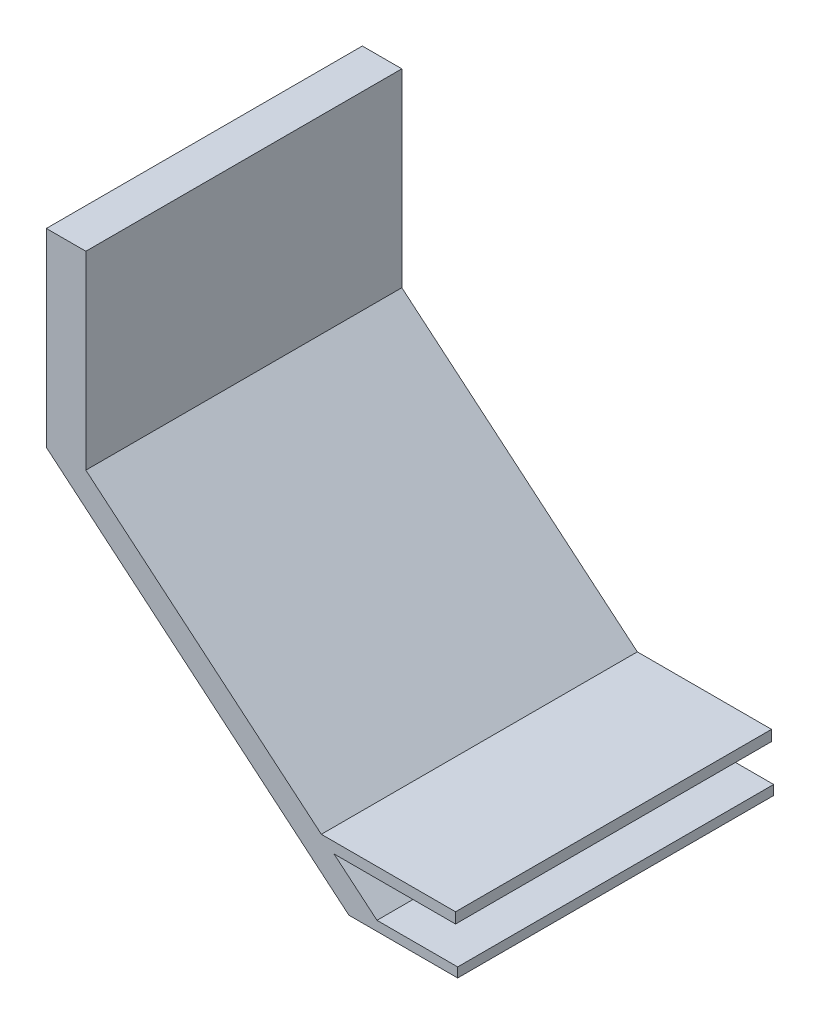
ISO-10303-21;
HEADER;
FILE_DESCRIPTION(('STEP AP214'),'2;1');
FILE_NAME('part.step','',(''),(''),'','','');
FILE_SCHEMA(('AUTOMOTIVE_DESIGN { 1 0 10303 214 1 1 1 1 }'));
ENDSEC;
DATA;
#1=APPLICATION_CONTEXT('core data for automotive mechanical design processes');
#2=APPLICATION_PROTOCOL_DEFINITION('international standard','automotive_design',2000,#1);
#3=PRODUCT_CONTEXT('',#1,'mechanical');
#4=PRODUCT('Part','Part','',(#3));
#5=PRODUCT_RELATED_PRODUCT_CATEGORY('part','',(#4));
#6=PRODUCT_DEFINITION_FORMATION('','',#4);
#7=PRODUCT_DEFINITION_CONTEXT('part definition',#1,'design');
#8=PRODUCT_DEFINITION('design','',#6,#7);
#9=PRODUCT_DEFINITION_SHAPE('','',#8);
#10=(LENGTH_UNIT() NAMED_UNIT(*) SI_UNIT(.MILLI.,.METRE.));
#11=(NAMED_UNIT(*) PLANE_ANGLE_UNIT() SI_UNIT($,.RADIAN.));
#12=(NAMED_UNIT(*) SI_UNIT($,.STERADIAN.) SOLID_ANGLE_UNIT());
#13=UNCERTAINTY_MEASURE_WITH_UNIT(LENGTH_MEASURE(1.E-05),#10,'distance_accuracy_value','');
#14=(GEOMETRIC_REPRESENTATION_CONTEXT(3) GLOBAL_UNCERTAINTY_ASSIGNED_CONTEXT((#13)) GLOBAL_UNIT_ASSIGNED_CONTEXT((#10,
#11,#12)) REPRESENTATION_CONTEXT('',''));
#15=CARTESIAN_POINT('',(0.,0.,0.));
#16=DIRECTION('',(0.,0.,1.));
#17=DIRECTION('',(1.,0.,0.));
#18=AXIS2_PLACEMENT_3D('',#15,#16,#17);
#19=CARTESIAN_POINT('',(-69.4178629598959,-82.7289875726682,200.));
#20=DIRECTION('',(0.642787609686541,0.766044443118977,0.));
#21=DIRECTION('',(-0.766044443118977,0.642787609686541,0.));
#22=AXIS2_PLACEMENT_3D('',#19,#20,#21);
#23=PLANE('',#22);
#24=DIRECTION('',(0.766044443118977,-0.642787609686541,0.));
#25=VECTOR('',#24,1.);
#26=CARTESIAN_POINT('',(-69.4178629598959,-82.7289875726682,0.));
#27=LINE('',#26,#25);
#28=CARTESIAN_POINT('',(-25.,-120.,0.));
#29=VERTEX_POINT('',#28);
#30=CARTESIAN_POINT('',(166.511110779744,-280.696902421635,0.));
#31=VERTEX_POINT('',#30);
#32=EDGE_CURVE('E163',#29,#31,#27,.T.);
#33=ORIENTED_EDGE('',*,*,#32,.T.);
#34=DIRECTION('',(0.,0.,-1.));
#35=VECTOR('',#34,1.);
#36=CARTESIAN_POINT('',(166.511110779744,-280.696902421635,200.));
#37=LINE('',#36,#35);
#38=CARTESIAN_POINT('',(166.511110779744,-280.696902421635,200.));
#39=VERTEX_POINT('',#38);
#40=EDGE_CURVE('E159',#39,#31,#37,.T.);
#41=ORIENTED_EDGE('',*,*,#40,.F.);
#42=DIRECTION('',(0.766044443118977,-0.642787609686541,0.));
#43=VECTOR('',#42,1.);
#44=CARTESIAN_POINT('',(-69.4178629598959,-82.7289875726682,200.));
#45=LINE('',#44,#43);
#46=CARTESIAN_POINT('',(-25.,-120.,200.));
#47=VERTEX_POINT('',#46);
#48=EDGE_CURVE('E242',#47,#39,#45,.T.);
#49=ORIENTED_EDGE('',*,*,#48,.F.);
#50=DIRECTION('',(0.,0.,-1.));
#51=VECTOR('',#50,1.);
#52=CARTESIAN_POINT('',(-25.,-120.,200.));
#53=LINE('',#52,#51);
#54=EDGE_CURVE('E203',#47,#29,#53,.T.);
#55=ORIENTED_EDGE('',*,*,#54,.T.);
#56=EDGE_LOOP('',(#33,#41,#49,#55));
#57=FACE_BOUND('',#56,.T.);
#58=ADVANCED_FACE('F95',(#57),#23,.F.);
#59=CARTESIAN_POINT('',(-6.23272328018921E-13,-280.696902421635,200.));
#60=DIRECTION('',(0.,1.,0.));
#61=DIRECTION('',(-1.,0.,0.));
#62=AXIS2_PLACEMENT_3D('',#59,#60,#61);
#63=PLANE('',#62);
#64=DIRECTION('',(1.,0.,0.));
#65=VECTOR('',#64,1.);
#66=CARTESIAN_POINT('',(-6.23272328018921E-13,-280.696902421635,0.));
#67=LINE('',#66,#65);
#68=CARTESIAN_POINT('',(235.34462255032,-280.696902421635,0.));
#69=VERTEX_POINT('',#68);
#70=EDGE_CURVE('E152',#31,#69,#67,.T.);
#71=ORIENTED_EDGE('',*,*,#70,.T.);
#72=DIRECTION('',(0.,0.,-1.));
#73=VECTOR('',#72,1.);
#74=CARTESIAN_POINT('',(235.34462255032,-280.696902421635,200.));
#75=LINE('',#74,#73);
#76=CARTESIAN_POINT('',(235.34462255032,-280.696902421635,200.));
#77=VERTEX_POINT('',#76);
#78=EDGE_CURVE('E155',#77,#69,#75,.T.);
#79=ORIENTED_EDGE('',*,*,#78,.F.);
#80=DIRECTION('',(1.,0.,0.));
#81=VECTOR('',#80,1.);
#82=CARTESIAN_POINT('',(-6.23272328018921E-13,-280.696902421635,200.));
#83=LINE('',#82,#81);
#84=EDGE_CURVE('E240',#39,#77,#83,.T.);
#85=ORIENTED_EDGE('',*,*,#84,.F.);
#86=ORIENTED_EDGE('',*,*,#40,.T.);
#87=EDGE_LOOP('',(#71,#79,#85,#86));
#88=FACE_BOUND('',#87,.T.);
#89=ADVANCED_FACE('F153',(#88),#63,.F.);
#90=CARTESIAN_POINT('',(-59.0884651807325,-70.4188906600156,200.));
#91=DIRECTION('',(0.642787609686541,0.766044443118977,0.));
#92=DIRECTION('',(-0.766044443118977,0.642787609686541,0.));
#93=AXIS2_PLACEMENT_3D('',#90,#91,#92);
#94=PLANE('',#93);
#95=DIRECTION('',(0.766044443118977,-0.642787609686541,0.));
#96=VECTOR('',#95,1.);
#97=CARTESIAN_POINT('',(-59.0884651807325,-70.4188906600156,0.));
#98=LINE('',#97,#96);
#99=CARTESIAN_POINT('',(157.07204494611,-251.799094982542,0.));
#100=VERTEX_POINT('',#99);
#101=CARTESIAN_POINT('',(184.261871364769,-274.614068302214,0.));
#102=VERTEX_POINT('',#101);
#103=EDGE_CURVE('E162',#100,#102,#98,.T.);
#104=ORIENTED_EDGE('',*,*,#103,.F.);
#105=DIRECTION('',(0.,0.,1.));
#106=VECTOR('',#105,1.);
#107=CARTESIAN_POINT('',(157.07204494611,-251.799094982542,200.));
#108=LINE('',#107,#106);
#109=CARTESIAN_POINT('',(157.07204494611,-251.799094982542,200.));
#110=VERTEX_POINT('',#109);
#111=EDGE_CURVE('E105',#100,#110,#108,.T.);
#112=ORIENTED_EDGE('',*,*,#111,.T.);
#113=DIRECTION('',(0.766044443118977,-0.642787609686541,0.));
#114=VECTOR('',#113,1.);
#115=CARTESIAN_POINT('',(-59.0884651807325,-70.4188906600156,200.));
#116=LINE('',#115,#114);
#117=CARTESIAN_POINT('',(184.261871364769,-274.614068302214,200.));
#118=VERTEX_POINT('',#117);
#119=EDGE_CURVE('E239',#110,#118,#116,.T.);
#120=ORIENTED_EDGE('',*,*,#119,.T.);
#121=DIRECTION('',(0.,0.,-1.));
#122=VECTOR('',#121,1.);
#123=CARTESIAN_POINT('',(184.261871364769,-274.614068302214,200.));
#124=LINE('',#123,#122);
#125=EDGE_CURVE('E114',#118,#102,#124,.T.);
#126=ORIENTED_EDGE('',*,*,#125,.T.);
#127=EDGE_LOOP('',(#104,#112,#120,#126));
#128=FACE_BOUND('',#127,.T.);
#129=ADVANCED_FACE('F310',(#128),#94,.T.);
#130=CARTESIAN_POINT('',(0.,-120.,200.));
#131=VERTEX_POINT('',#130);
#132=CARTESIAN_POINT('',(149.051279920604,-245.068874007881,200.));
#133=VERTEX_POINT('',#132);
#134=EDGE_CURVE('E236',#131,#133,#116,.T.);
#135=ORIENTED_EDGE('',*,*,#134,.T.);
#136=DIRECTION('',(0.,0.,-1.));
#137=VECTOR('',#136,1.);
#138=CARTESIAN_POINT('',(149.051279920604,-245.068874007881,200.));
#139=LINE('',#138,#137);
#140=CARTESIAN_POINT('',(149.051279920604,-245.068874007881,0.));
#141=VERTEX_POINT('',#140);
#142=EDGE_CURVE('E12',#133,#141,#139,.T.);
#143=ORIENTED_EDGE('',*,*,#142,.T.);
#144=CARTESIAN_POINT('',(0.,-120.,0.));
#145=VERTEX_POINT('',#144);
#146=EDGE_CURVE('E224',#145,#141,#98,.T.);
#147=ORIENTED_EDGE('',*,*,#146,.F.);
#148=DIRECTION('',(0.,0.,-1.));
#149=VECTOR('',#148,1.);
#150=CARTESIAN_POINT('',(0.,-120.,200.));
#151=LINE('',#150,#149);
#152=EDGE_CURVE('E207',#131,#145,#151,.T.);
#153=ORIENTED_EDGE('',*,*,#152,.F.);
#154=EDGE_LOOP('',(#135,#143,#147,#153));
#155=FACE_BOUND('',#154,.T.);
#156=ADVANCED_FACE('F288',(#155),#94,.T.);
#157=CARTESIAN_POINT('',(0.,0.,200.));
#158=DIRECTION('',(1.,0.,0.));
#159=DIRECTION('',(0.,1.,0.));
#160=AXIS2_PLACEMENT_3D('',#157,#158,#159);
#161=PLANE('',#160);
#162=DIRECTION('',(0.,-1.,0.));
#163=VECTOR('',#162,1.);
#164=CARTESIAN_POINT('',(0.,0.,0.));
#165=LINE('',#164,#163);
#166=CARTESIAN_POINT('',(0.,0.,0.));
#167=VERTEX_POINT('',#166);
#168=EDGE_CURVE('E221',#167,#145,#165,.T.);
#169=ORIENTED_EDGE('',*,*,#168,.F.);
#170=DIRECTION('',(0.,0.,-1.));
#171=VECTOR('',#170,1.);
#172=CARTESIAN_POINT('',(0.,0.,200.));
#173=LINE('',#172,#171);
#174=CARTESIAN_POINT('',(0.,0.,200.));
#175=VERTEX_POINT('',#174);
#176=EDGE_CURVE('E210',#175,#167,#173,.T.);
#177=ORIENTED_EDGE('',*,*,#176,.F.);
#178=DIRECTION('',(0.,-1.,0.));
#179=VECTOR('',#178,1.);
#180=CARTESIAN_POINT('',(0.,0.,200.));
#181=LINE('',#180,#179);
#182=EDGE_CURVE('E233',#175,#131,#181,.T.);
#183=ORIENTED_EDGE('',*,*,#182,.T.);
#184=ORIENTED_EDGE('',*,*,#152,.T.);
#185=EDGE_LOOP('',(#169,#177,#183,#184));
#186=FACE_BOUND('',#185,.T.);
#187=ADVANCED_FACE('F293',(#186),#161,.T.);
#188=CARTESIAN_POINT('',(0.,0.,200.));
#189=DIRECTION('',(0.,-1.,0.));
#190=DIRECTION('',(1.,0.,0.));
#191=AXIS2_PLACEMENT_3D('',#188,#189,#190);
#192=PLANE('',#191);
#193=DIRECTION('',(-1.,0.,0.));
#194=VECTOR('',#193,1.);
#195=CARTESIAN_POINT('',(0.,0.,0.));
#196=LINE('',#195,#194);
#197=CARTESIAN_POINT('',(-25.,0.,0.));
#198=VERTEX_POINT('',#197);
#199=EDGE_CURVE('E217',#167,#198,#196,.T.);
#200=ORIENTED_EDGE('',*,*,#199,.T.);
#201=DIRECTION('',(0.,0.,-1.));
#202=VECTOR('',#201,1.);
#203=CARTESIAN_POINT('',(-25.,0.,200.));
#204=LINE('',#203,#202);
#205=CARTESIAN_POINT('',(-25.,0.,200.));
#206=VERTEX_POINT('',#205);
#207=EDGE_CURVE('E213',#206,#198,#204,.T.);
#208=ORIENTED_EDGE('',*,*,#207,.F.);
#209=DIRECTION('',(-1.,0.,0.));
#210=VECTOR('',#209,1.);
#211=CARTESIAN_POINT('',(0.,0.,200.));
#212=LINE('',#211,#210);
#213=EDGE_CURVE('E216',#175,#206,#212,.T.);
#214=ORIENTED_EDGE('',*,*,#213,.F.);
#215=ORIENTED_EDGE('',*,*,#176,.T.);
#216=EDGE_LOOP('',(#200,#208,#214,#215));
#217=FACE_BOUND('',#216,.T.);
#218=ADVANCED_FACE('F298',(#217),#192,.F.);
#219=CARTESIAN_POINT('',(-25.,0.,200.));
#220=DIRECTION('',(1.,0.,0.));
#221=DIRECTION('',(0.,1.,0.));
#222=AXIS2_PLACEMENT_3D('',#219,#220,#221);
#223=PLANE('',#222);
#224=DIRECTION('',(0.,-1.,0.));
#225=VECTOR('',#224,1.);
#226=CARTESIAN_POINT('',(-25.,0.,0.));
#227=LINE('',#226,#225);
#228=EDGE_CURVE('E181',#198,#29,#227,.T.);
#229=ORIENTED_EDGE('',*,*,#228,.T.);
#230=ORIENTED_EDGE('',*,*,#54,.F.);
#231=DIRECTION('',(0.,-1.,0.));
#232=VECTOR('',#231,1.);
#233=CARTESIAN_POINT('',(-25.,0.,200.));
#234=LINE('',#233,#232);
#235=EDGE_CURVE('E220',#206,#47,#234,.T.);
#236=ORIENTED_EDGE('',*,*,#235,.F.);
#237=ORIENTED_EDGE('',*,*,#207,.T.);
#238=EDGE_LOOP('',(#229,#230,#236,#237));
#239=FACE_BOUND('',#238,.T.);
#240=ADVANCED_FACE('F260',(#239),#223,.F.);
#241=CARTESIAN_POINT('',(0.,0.,0.));
#242=DIRECTION('',(0.,0.,1.));
#243=DIRECTION('',(1.,0.,0.));
#244=AXIS2_PLACEMENT_3D('',#241,#242,#243);
#245=PLANE('',#244);
#246=ORIENTED_EDGE('',*,*,#228,.F.);
#247=ORIENTED_EDGE('',*,*,#199,.F.);
#248=ORIENTED_EDGE('',*,*,#168,.T.);
#249=ORIENTED_EDGE('',*,*,#146,.T.);
#250=DIRECTION('',(-1.,0.,0.));
#251=VECTOR('',#250,1.);
#252=CARTESIAN_POINT('',(233.990264512443,-245.068874007881,0.));
#253=LINE('',#252,#251);
#254=CARTESIAN_POINT('',(233.990264512443,-245.068874007881,0.));
#255=VERTEX_POINT('',#254);
#256=EDGE_CURVE('E190',#255,#141,#253,.T.);
#257=ORIENTED_EDGE('',*,*,#256,.F.);
#258=DIRECTION('',(0.,1.,0.));
#259=VECTOR('',#258,1.);
#260=CARTESIAN_POINT('',(233.990264512443,-251.799094982542,0.));
#261=LINE('',#260,#259);
#262=CARTESIAN_POINT('',(233.990264512443,-251.799094982542,0.));
#263=VERTEX_POINT('',#262);
#264=EDGE_CURVE('E167',#263,#255,#261,.T.);
#265=ORIENTED_EDGE('',*,*,#264,.F.);
#266=DIRECTION('',(1.,0.,0.));
#267=VECTOR('',#266,1.);
#268=CARTESIAN_POINT('',(157.07204494611,-251.799094982542,0.));
#269=LINE('',#268,#267);
#270=EDGE_CURVE('E187',#100,#263,#269,.T.);
#271=ORIENTED_EDGE('',*,*,#270,.F.);
#272=ORIENTED_EDGE('',*,*,#103,.T.);
#273=DIRECTION('',(-1.,0.,0.));
#274=VECTOR('',#273,1.);
#275=CARTESIAN_POINT('',(235.34462255032,-274.614068302214,0.));
#276=LINE('',#275,#274);
#277=CARTESIAN_POINT('',(235.34462255032,-274.614068302214,0.));
#278=VERTEX_POINT('',#277);
#279=EDGE_CURVE('E172',#278,#102,#276,.T.);
#280=ORIENTED_EDGE('',*,*,#279,.F.);
#281=DIRECTION('',(0.,1.,0.));
#282=VECTOR('',#281,1.);
#283=CARTESIAN_POINT('',(235.34462255032,-280.696902421635,0.));
#284=LINE('',#283,#282);
#285=EDGE_CURVE('E145',#69,#278,#284,.T.);
#286=ORIENTED_EDGE('',*,*,#285,.F.);
#287=ORIENTED_EDGE('',*,*,#70,.F.);
#288=ORIENTED_EDGE('',*,*,#32,.F.);
#289=EDGE_LOOP('',(#246,#247,#248,#249,#257,#265,#271,#272,#280,#286,#287,#288));
#290=FACE_BOUND('',#289,.T.);
#291=ADVANCED_FACE('F170',(#290),#245,.F.);
#292=CARTESIAN_POINT('',(0.,0.,200.));
#293=DIRECTION('',(0.,0.,1.));
#294=DIRECTION('',(1.,0.,0.));
#295=AXIS2_PLACEMENT_3D('',#292,#293,#294);
#296=PLANE('',#295);
#297=ORIENTED_EDGE('',*,*,#235,.T.);
#298=ORIENTED_EDGE('',*,*,#48,.T.);
#299=ORIENTED_EDGE('',*,*,#84,.T.);
#300=DIRECTION('',(0.,1.,0.));
#301=VECTOR('',#300,1.);
#302=CARTESIAN_POINT('',(235.34462255032,-280.696902421635,200.));
#303=LINE('',#302,#301);
#304=CARTESIAN_POINT('',(235.34462255032,-274.614068302214,200.));
#305=VERTEX_POINT('',#304);
#306=EDGE_CURVE('E166',#77,#305,#303,.T.);
#307=ORIENTED_EDGE('',*,*,#306,.T.);
#308=DIRECTION('',(-1.,0.,0.));
#309=VECTOR('',#308,1.);
#310=CARTESIAN_POINT('',(235.34462255032,-274.614068302214,200.));
#311=LINE('',#310,#309);
#312=EDGE_CURVE('E173',#305,#118,#311,.T.);
#313=ORIENTED_EDGE('',*,*,#312,.T.);
#314=ORIENTED_EDGE('',*,*,#119,.F.);
#315=DIRECTION('',(1.,0.,0.));
#316=VECTOR('',#315,1.);
#317=CARTESIAN_POINT('',(157.07204494611,-251.799094982542,200.));
#318=LINE('',#317,#316);
#319=CARTESIAN_POINT('',(233.990264512443,-251.799094982542,200.));
#320=VERTEX_POINT('',#319);
#321=EDGE_CURVE('E186',#110,#320,#318,.T.);
#322=ORIENTED_EDGE('',*,*,#321,.T.);
#323=DIRECTION('',(0.,1.,0.));
#324=VECTOR('',#323,1.);
#325=CARTESIAN_POINT('',(233.990264512443,-251.799094982542,200.));
#326=LINE('',#325,#324);
#327=CARTESIAN_POINT('',(233.990264512443,-245.068874007881,200.));
#328=VERTEX_POINT('',#327);
#329=EDGE_CURVE('E189',#320,#328,#326,.T.);
#330=ORIENTED_EDGE('',*,*,#329,.T.);
#331=DIRECTION('',(-1.,0.,0.));
#332=VECTOR('',#331,1.);
#333=CARTESIAN_POINT('',(233.990264512443,-245.068874007881,200.));
#334=LINE('',#333,#332);
#335=EDGE_CURVE('E196',#328,#133,#334,.T.);
#336=ORIENTED_EDGE('',*,*,#335,.T.);
#337=ORIENTED_EDGE('',*,*,#134,.F.);
#338=ORIENTED_EDGE('',*,*,#182,.F.);
#339=ORIENTED_EDGE('',*,*,#213,.T.);
#340=EDGE_LOOP('',(#297,#298,#299,#307,#313,#314,#322,#330,#336,#337,#338,#339));
#341=FACE_BOUND('',#340,.T.);
#342=ADVANCED_FACE('F250',(#341),#296,.T.);
#343=CARTESIAN_POINT('',(235.34462255032,-280.696902421635,200.));
#344=DIRECTION('',(-1.,0.,0.));
#345=DIRECTION('',(0.,0.,1.));
#346=AXIS2_PLACEMENT_3D('',#343,#344,#345);
#347=PLANE('',#346);
#348=ORIENTED_EDGE('',*,*,#285,.T.);
#349=DIRECTION('',(0.,0.,-1.));
#350=VECTOR('',#349,1.);
#351=CARTESIAN_POINT('',(235.34462255032,-274.614068302214,200.));
#352=LINE('',#351,#350);
#353=EDGE_CURVE('E99',#305,#278,#352,.T.);
#354=ORIENTED_EDGE('',*,*,#353,.F.);
#355=ORIENTED_EDGE('',*,*,#306,.F.);
#356=ORIENTED_EDGE('',*,*,#78,.T.);
#357=EDGE_LOOP('',(#348,#354,#355,#356));
#358=FACE_BOUND('',#357,.T.);
#359=ADVANCED_FACE('F165',(#358),#347,.F.);
#360=CARTESIAN_POINT('',(235.34462255032,-274.614068302214,200.));
#361=DIRECTION('',(0.,-1.,0.));
#362=DIRECTION('',(1.,0.,0.));
#363=AXIS2_PLACEMENT_3D('',#360,#361,#362);
#364=PLANE('',#363);
#365=ORIENTED_EDGE('',*,*,#279,.T.);
#366=ORIENTED_EDGE('',*,*,#125,.F.);
#367=ORIENTED_EDGE('',*,*,#312,.F.);
#368=ORIENTED_EDGE('',*,*,#353,.T.);
#369=EDGE_LOOP('',(#365,#366,#367,#368));
#370=FACE_BOUND('',#369,.T.);
#371=ADVANCED_FACE('F97',(#370),#364,.F.);
#372=CARTESIAN_POINT('',(233.990264512443,-245.068874007881,200.));
#373=DIRECTION('',(0.,-1.,0.));
#374=DIRECTION('',(1.,0.,0.));
#375=AXIS2_PLACEMENT_3D('',#372,#373,#374);
#376=PLANE('',#375);
#377=ORIENTED_EDGE('',*,*,#256,.T.);
#378=ORIENTED_EDGE('',*,*,#142,.F.);
#379=ORIENTED_EDGE('',*,*,#335,.F.);
#380=DIRECTION('',(0.,0.,-1.));
#381=VECTOR('',#380,1.);
#382=CARTESIAN_POINT('',(233.990264512443,-245.068874007881,200.));
#383=LINE('',#382,#381);
#384=EDGE_CURVE('E179',#328,#255,#383,.T.);
#385=ORIENTED_EDGE('',*,*,#384,.T.);
#386=EDGE_LOOP('',(#377,#378,#379,#385));
#387=FACE_BOUND('',#386,.T.);
#388=ADVANCED_FACE('F280',(#387),#376,.F.);
#389=CARTESIAN_POINT('',(157.07204494611,-251.799094982542,200.));
#390=DIRECTION('',(0.,1.,0.));
#391=DIRECTION('',(0.,0.,1.));
#392=AXIS2_PLACEMENT_3D('',#389,#390,#391);
#393=PLANE('',#392);
#394=ORIENTED_EDGE('',*,*,#270,.T.);
#395=DIRECTION('',(0.,0.,-1.));
#396=VECTOR('',#395,1.);
#397=CARTESIAN_POINT('',(233.990264512443,-251.799094982542,200.));
#398=LINE('',#397,#396);
#399=EDGE_CURVE('E182',#320,#263,#398,.T.);
#400=ORIENTED_EDGE('',*,*,#399,.F.);
#401=ORIENTED_EDGE('',*,*,#321,.F.);
#402=ORIENTED_EDGE('',*,*,#111,.F.);
#403=EDGE_LOOP('',(#394,#400,#401,#402));
#404=FACE_BOUND('',#403,.T.);
#405=ADVANCED_FACE('F306',(#404),#393,.F.);
#406=CARTESIAN_POINT('',(233.990264512443,-251.799094982542,200.));
#407=DIRECTION('',(-1.,0.,0.));
#408=DIRECTION('',(0.,0.,1.));
#409=AXIS2_PLACEMENT_3D('',#406,#407,#408);
#410=PLANE('',#409);
#411=ORIENTED_EDGE('',*,*,#264,.T.);
#412=ORIENTED_EDGE('',*,*,#384,.F.);
#413=ORIENTED_EDGE('',*,*,#329,.F.);
#414=ORIENTED_EDGE('',*,*,#399,.T.);
#415=EDGE_LOOP('',(#411,#412,#413,#414));
#416=FACE_BOUND('',#415,.T.);
#417=ADVANCED_FACE('F302',(#416),#410,.F.);
#418=CLOSED_SHELL('',(#58,#89,#129,#156,#187,#218,#240,#291,#342,#359,#371,#388,#405,#417));
#419=MANIFOLD_SOLID_BREP('B2',#418);
#420=ADVANCED_BREP_SHAPE_REPRESENTATION('',(#18,#419),#14);
#421=SHAPE_DEFINITION_REPRESENTATION(#9,#420);
ENDSEC;
END-ISO-10303-21;
